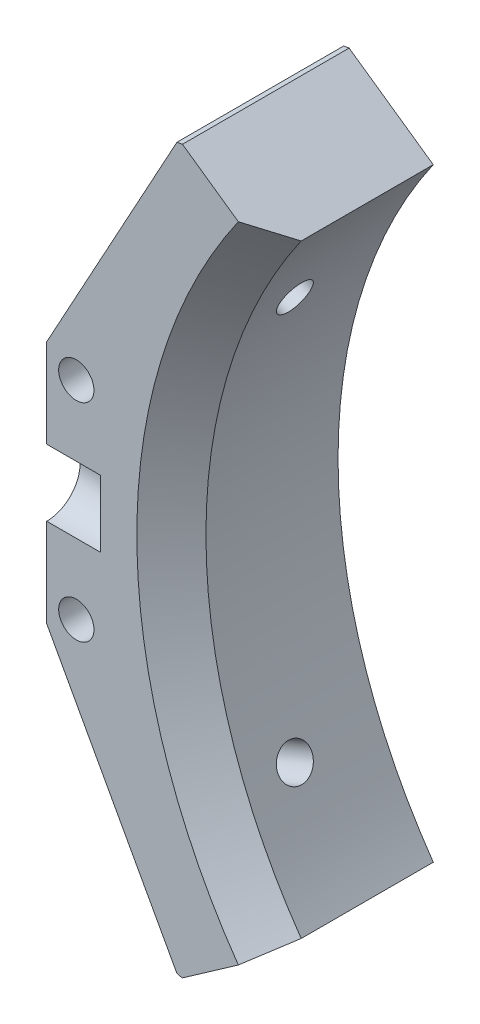
ISO-10303-21;
HEADER;
FILE_DESCRIPTION(('STEP AP214'),'2;1');
FILE_NAME('part.step','',(''),(''),'','','');
FILE_SCHEMA(('AUTOMOTIVE_DESIGN { 1 0 10303 214 1 1 1 1 }'));
ENDSEC;
DATA;
#1=APPLICATION_CONTEXT('core data for automotive mechanical design processes');
#2=APPLICATION_PROTOCOL_DEFINITION('international standard','automotive_design',2000,#1);
#3=PRODUCT_CONTEXT('',#1,'mechanical');
#4=PRODUCT('Part','Part','',(#3));
#5=PRODUCT_RELATED_PRODUCT_CATEGORY('part','',(#4));
#6=PRODUCT_DEFINITION_FORMATION('','',#4);
#7=PRODUCT_DEFINITION_CONTEXT('part definition',#1,'design');
#8=PRODUCT_DEFINITION('design','',#6,#7);
#9=PRODUCT_DEFINITION_SHAPE('','',#8);
#10=(LENGTH_UNIT() NAMED_UNIT(*) SI_UNIT(.MILLI.,.METRE.));
#11=(NAMED_UNIT(*) PLANE_ANGLE_UNIT() SI_UNIT($,.RADIAN.));
#12=(NAMED_UNIT(*) SI_UNIT($,.STERADIAN.) SOLID_ANGLE_UNIT());
#13=UNCERTAINTY_MEASURE_WITH_UNIT(LENGTH_MEASURE(1.E-05),#10,'distance_accuracy_value','');
#14=(GEOMETRIC_REPRESENTATION_CONTEXT(3) GLOBAL_UNCERTAINTY_ASSIGNED_CONTEXT((#13)) GLOBAL_UNIT_ASSIGNED_CONTEXT((#10,
#11,#12)) REPRESENTATION_CONTEXT('',''));
#15=CARTESIAN_POINT('',(0.,0.,0.));
#16=DIRECTION('',(0.,0.,1.));
#17=DIRECTION('',(1.,0.,0.));
#18=AXIS2_PLACEMENT_3D('',#15,#16,#17);
#19=CARTESIAN_POINT('',(-78.7145361699616,-32.6046284375058,12.0578499999987));
#20=DIRECTION('',(0.923879532511284,0.382683432365096,0.));
#21=DIRECTION('',(-0.382683432365096,0.923879532511284,0.));
#22=AXIS2_PLACEMENT_3D('',#19,#20,#21);
#23=PLANE('',#22);
#24=CARTESIAN_POINT('',(-78.7145361699615,-32.6046284375059,12.0578499999987));
#25=DIRECTION('',(0.923879532511284,0.382683432365096,0.));
#26=DIRECTION('',(-0.382683432365096,0.923879532511284,0.));
#27=AXIS2_PLACEMENT_3D('',#24,#25,#26);
#28=CIRCLE('',#27,5.);
#29=CARTESIAN_POINT('',(-80.627953331787,-27.9852307749494,12.0578499999987));
#30=VERTEX_POINT('',#29);
#31=EDGE_CURVE('E325',#30,#30,#28,.F.);
#32=ORIENTED_EDGE('',*,*,#31,.T.);
#33=EDGE_LOOP('',(#32));
#34=FACE_BOUND('',#33,.T.);
#35=CARTESIAN_POINT('',(-78.7145361699616,-32.6046284375059,12.0578499999987));
#36=DIRECTION('',(-0.923879532511285,-0.382683432365095,0.));
#37=DIRECTION('',(0.382683432365095,-0.923879532511285,0.));
#38=AXIS2_PLACEMENT_3D('',#35,#36,#37);
#39=CIRCLE('',#38,2.5);
#40=CARTESIAN_POINT('',(-77.7578275890489,-34.9143272687841,12.0578499999987));
#41=VERTEX_POINT('',#40);
#42=EDGE_CURVE('E343',#41,#41,#39,.F.);
#43=ORIENTED_EDGE('',*,*,#42,.T.);
#44=EDGE_LOOP('',(#43));
#45=FACE_BOUND('',#44,.T.);
#46=ADVANCED_FACE('F64',(#34,#45),#23,.F.);
#47=CARTESIAN_POINT('',(-78.7145361699616,32.6046284375058,12.0578499999987));
#48=DIRECTION('',(0.923879532511284,-0.382683432365096,0.));
#49=DIRECTION('',(0.382683432365096,0.923879532511284,0.));
#50=AXIS2_PLACEMENT_3D('',#47,#48,#49);
#51=PLANE('',#50);
#52=CARTESIAN_POINT('',(-78.7145361699615,32.6046284375059,12.0578499999987));
#53=DIRECTION('',(0.923879532511284,-0.382683432365096,0.));
#54=DIRECTION('',(0.382683432365096,0.923879532511284,0.));
#55=AXIS2_PLACEMENT_3D('',#52,#53,#54);
#56=CIRCLE('',#55,5.);
#57=CARTESIAN_POINT('',(-76.801119008136,37.2240261000623,12.0578499999987));
#58=VERTEX_POINT('',#57);
#59=EDGE_CURVE('E218',#58,#58,#56,.F.);
#60=ORIENTED_EDGE('',*,*,#59,.T.);
#61=EDGE_LOOP('',(#60));
#62=FACE_BOUND('',#61,.T.);
#63=CARTESIAN_POINT('',(-78.7145361699617,32.6046284375059,12.0578499999987));
#64=DIRECTION('',(-0.923879532511285,0.382683432365095,0.));
#65=DIRECTION('',(-0.382683432365095,-0.923879532511285,0.));
#66=AXIS2_PLACEMENT_3D('',#63,#64,#65);
#67=CIRCLE('',#66,2.5);
#68=CARTESIAN_POINT('',(-79.6712447508744,30.2949296062277,12.0578499999987));
#69=VERTEX_POINT('',#68);
#70=EDGE_CURVE('E346',#69,#69,#67,.F.);
#71=ORIENTED_EDGE('',*,*,#70,.T.);
#72=EDGE_LOOP('',(#71));
#73=FACE_BOUND('',#72,.T.);
#74=ADVANCED_FACE('F550',(#62,#73),#51,.F.);
#75=CARTESIAN_POINT('',(-86.49,0.,0.));
#76=DIRECTION('',(-1.,0.,0.));
#77=DIRECTION('',(0.,0.,1.));
#78=AXIS2_PLACEMENT_3D('',#75,#76,#77);
#79=PLANE('',#78);
#80=DIRECTION('',(0.,1.,0.));
#81=VECTOR('',#80,1.);
#82=CARTESIAN_POINT('',(-86.49,-21.209,24.1156999999974));
#83=LINE('',#82,#81);
#84=CARTESIAN_POINT('',(-86.49,4.82600000000003,24.1156999999974));
#85=VERTEX_POINT('',#84);
#86=CARTESIAN_POINT('',(-86.49,-4.82599999999994,24.1156999999974));
#87=VERTEX_POINT('',#86);
#88=EDGE_CURVE('E338',#85,#87,#83,.F.);
#89=ORIENTED_EDGE('',*,*,#88,.F.);
#90=CARTESIAN_POINT('',(-86.49,0.,24.1156999999974));
#91=DIRECTION('',(-1.,0.,0.));
#92=DIRECTION('',(0.,0.,1.));
#93=AXIS2_PLACEMENT_3D('',#90,#91,#92);
#94=CIRCLE('',#93,4.826);
#95=EDGE_CURVE('E351',#85,#87,#94,.T.);
#96=ORIENTED_EDGE('',*,*,#95,.T.);
#97=EDGE_LOOP('',(#89,#96));
#98=FACE_BOUND('',#97,.T.);
#99=ADVANCED_FACE('F525',(#98),#79,.T.);
#100=CARTESIAN_POINT('',(-1.27459187326294E-13,-3.07713698692186E-13,12.0578499999987));
#101=DIRECTION('',(0.923879532511284,-0.382683432365096,0.));
#102=DIRECTION('',(0.382683432365096,0.923879532511284,0.));
#103=AXIS2_PLACEMENT_3D('',#100,#101,#102);
#104=CYLINDRICAL_SURFACE('',#103,5.);
#105=ORIENTED_EDGE('',*,*,#59,.F.);
#106=EDGE_LOOP('',(#105));
#107=FACE_BOUND('',#106,.T.);
#108=CARTESIAN_POINT('',(-84.7046375756921,35.0858096797497,12.0578499999987));
#109=DIRECTION('',(0.877185534800813,-0.480151577667108,0.));
#110=DIRECTION('',(0.480151577667108,0.877185534800813,0.));
#111=AXIS2_PLACEMENT_3D('',#108,#109,#110);
#112=ELLIPSE('',#111,5.02937246252399,5.);
#113=CARTESIAN_POINT('',(-82.2897764531357,39.4975024530013,12.0578499999987));
#114=VERTEX_POINT('',#113);
#115=EDGE_CURVE('E283',#114,#114,#112,.F.);
#116=ORIENTED_EDGE('',*,*,#115,.T.);
#117=EDGE_LOOP('',(#116));
#118=FACE_BOUND('',#117,.T.);
#119=ADVANCED_FACE('F540',(#107,#118),#104,.F.);
#120=CARTESIAN_POINT('',(-86.49,0.,24.1156999999974));
#121=DIRECTION('',(-1.,0.,0.));
#122=DIRECTION('',(0.,0.,1.));
#123=AXIS2_PLACEMENT_3D('',#120,#121,#122);
#124=CYLINDRICAL_SURFACE('',#123,4.826);
#125=DIRECTION('',(1.,0.,0.));
#126=VECTOR('',#125,1.);
#127=CARTESIAN_POINT('',(-104.49,-4.82599999999994,24.1156999999974));
#128=LINE('',#127,#126);
#129=CARTESIAN_POINT('',(-94.239999992,-4.82599999999994,24.1156999999974));
#130=VERTEX_POINT('',#129);
#131=EDGE_CURVE('E370',#87,#130,#128,.F.);
#132=ORIENTED_EDGE('',*,*,#131,.F.);
#133=ORIENTED_EDGE('',*,*,#95,.F.);
#134=DIRECTION('',(1.,0.,0.));
#135=VECTOR('',#134,1.);
#136=CARTESIAN_POINT('',(-104.49,4.826,24.1156999999974));
#137=LINE('',#136,#135);
#138=CARTESIAN_POINT('',(-94.239999992,4.826,24.1156999999974));
#139=VERTEX_POINT('',#138);
#140=EDGE_CURVE('E334',#139,#85,#137,.T.);
#141=ORIENTED_EDGE('',*,*,#140,.F.);
#142=CARTESIAN_POINT('',(-94.239999992,0.,24.1156999999974));
#143=DIRECTION('',(1.,0.,0.));
#144=DIRECTION('',(0.,0.,-1.));
#145=AXIS2_PLACEMENT_3D('',#142,#143,#144);
#146=CIRCLE('',#145,4.826);
#147=EDGE_CURVE('E282',#139,#130,#146,.F.);
#148=ORIENTED_EDGE('',*,*,#147,.T.);
#149=EDGE_LOOP('',(#132,#133,#141,#148));
#150=FACE_BOUND('',#149,.T.);
#151=ADVANCED_FACE('F527',(#150),#124,.F.);
#152=CARTESIAN_POINT('',(-1.27459187326294E-13,3.07713698692186E-13,12.0578499999987));
#153=DIRECTION('',(0.923879532511284,0.382683432365096,0.));
#154=DIRECTION('',(-0.382683432365096,0.923879532511284,0.));
#155=AXIS2_PLACEMENT_3D('',#152,#153,#154);
#156=CYLINDRICAL_SURFACE('',#155,5.);
#157=ORIENTED_EDGE('',*,*,#31,.F.);
#158=EDGE_LOOP('',(#157));
#159=FACE_BOUND('',#158,.T.);
#160=CARTESIAN_POINT('',(-84.7046375756921,-35.0858096797497,12.0578499999987));
#161=DIRECTION('',(-0.877185534800813,-0.480151577667108,0.));
#162=DIRECTION('',(0.480151577667108,-0.877185534800813,0.));
#163=AXIS2_PLACEMENT_3D('',#160,#161,#162);
#164=ELLIPSE('',#163,5.02937246252399,5.);
#165=CARTESIAN_POINT('',(-82.2897764531357,-39.4975024530013,12.0578499999987));
#166=VERTEX_POINT('',#165);
#167=EDGE_CURVE('E357',#166,#166,#164,.F.);
#168=ORIENTED_EDGE('',*,*,#167,.F.);
#169=EDGE_LOOP('',(#168));
#170=FACE_BOUND('',#169,.T.);
#171=ADVANCED_FACE('F531',(#159,#170),#156,.F.);
#172=CARTESIAN_POINT('',(-78.7145361699616,-32.6046284375059,12.0578499999987));
#173=DIRECTION('',(-0.923879532511285,-0.382683432365095,0.));
#174=DIRECTION('',(0.382683432365095,-0.923879532511285,0.));
#175=AXIS2_PLACEMENT_3D('',#172,#173,#174);
#176=CYLINDRICAL_SURFACE('',#175,2.5);
#177=CARTESIAN_POINT('',(-69.4050128348201,-31.4544781135924,12.0578499999987));
#178=CARTESIAN_POINT('',(-69.4050155262785,-31.4544729264997,11.9175821214027));
#179=CARTESIAN_POINT('',(-69.4099109432,-31.4436772281154,11.7771248785826));
#180=CARTESIAN_POINT('',(-69.4293504182207,-31.4007298800319,11.4999926930088));
#181=CARTESIAN_POINT('',(-69.4439150884446,-31.3685326080248,11.363326481447));
#182=CARTESIAN_POINT('',(-69.4821899394872,-31.2836608235691,11.0979628689418));
#183=CARTESIAN_POINT('',(-69.5058923428029,-31.2310037250273,10.9692587989066));
#184=CARTESIAN_POINT('',(-69.561621038899,-31.1066792753156,10.7234353046449));
#185=CARTESIAN_POINT('',(-69.5936434227056,-31.035020851208,10.6063104757271));
#186=CARTESIAN_POINT('',(-69.6649599302289,-30.8746019239935,10.3868257325083));
#187=CARTESIAN_POINT('',(-69.7042579022574,-30.7858323691865,10.2844736832697));
#188=CARTESIAN_POINT('',(-69.7888219672717,-30.5936484736216,10.0975042049073));
#189=CARTESIAN_POINT('',(-69.8340885791487,-30.4902328595322,10.0128883193575));
#190=CARTESIAN_POINT('',(-69.9291380895632,-30.2716011412831,9.86378854849302));
#191=CARTESIAN_POINT('',(-69.9789218344216,-30.1563828252691,9.79930844587155));
#192=CARTESIAN_POINT('',(-70.0814368361719,-29.9173712531017,9.692335985796));
#193=CARTESIAN_POINT('',(-70.1341680545008,-29.7935781091312,9.64984334074576));
#194=CARTESIAN_POINT('',(-70.2409568782755,-29.5409337715377,9.5880657560836));
#195=CARTESIAN_POINT('',(-70.2950140001858,-29.4120844118462,9.56877248075875));
#196=CARTESIAN_POINT('',(-70.4028879484659,-29.152925510869,9.5539156287366));
#197=CARTESIAN_POINT('',(-70.4567047754644,-29.0226159734072,9.55835198991231));
#198=CARTESIAN_POINT('',(-70.5625599130229,-28.7642941941806,9.59082138801434));
#199=CARTESIAN_POINT('',(-70.6145989097948,-28.6362810753093,9.61884521101529));
#200=CARTESIAN_POINT('',(-70.7155154061952,-28.3861600109105,9.69768024276973));
#201=CARTESIAN_POINT('',(-70.7643928679184,-28.2640521361883,9.7484917246782));
#202=CARTESIAN_POINT('',(-70.8577332025921,-28.0292281668644,9.87147234767087));
#203=CARTESIAN_POINT('',(-70.9021950455273,-27.9165142645413,9.94364645638132));
#204=CARTESIAN_POINT('',(-70.985587935264,-27.7037791616017,10.1072932617145));
#205=CARTESIAN_POINT('',(-71.0245194383835,-27.6037569138475,10.1987643645591));
#206=CARTESIAN_POINT('',(-71.0959430328462,-27.4192759631007,10.3984420561186));
#207=CARTESIAN_POINT('',(-71.1284333307795,-27.3348215950951,10.506653290861));
#208=CARTESIAN_POINT('',(-71.1862328692133,-27.1839438385448,10.7367896512081));
#209=CARTESIAN_POINT('',(-71.2115387127945,-27.117528979995,10.8587212260806));
#210=CARTESIAN_POINT('',(-71.2544058608657,-27.0046904567927,11.1128705628823));
#211=CARTESIAN_POINT('',(-71.2719606080216,-26.9582837195476,11.2450969232729));
#212=CARTESIAN_POINT('',(-71.2988878374524,-26.8869869517858,11.5158211215115));
#213=CARTESIAN_POINT('',(-71.3082777283444,-26.8620511433562,11.6543049505942));
#214=CARTESIAN_POINT('',(-71.31514560753,-26.8438077554102,11.8377003491377));
#215=CARTESIAN_POINT('',(-71.3163765176452,-26.8405373657908,11.8816526201377));
#216=CARTESIAN_POINT('',(-71.3180189895794,-26.8361728379483,11.9696803564153));
#217=CARTESIAN_POINT('',(-71.3184305513848,-26.8350786997608,12.0137558216948));
#218=CARTESIAN_POINT('',(-71.3184282319656,-26.8350860220129,12.1981178785948));
#219=CARTESIAN_POINT('',(-71.3142561029324,-26.84618131605,12.3385751214149));
#220=CARTESIAN_POINT('',(-71.2976335264784,-26.8902954617237,12.6157073069886));
#221=CARTESIAN_POINT('',(-71.2851653941875,-26.9233611481767,12.7523735185504));
#222=CARTESIAN_POINT('',(-71.2522163865886,-27.0104389692178,13.0177371310556));
#223=CARTESIAN_POINT('',(-71.2317423252471,-27.0644332907893,13.1464412010908));
#224=CARTESIAN_POINT('',(-71.1832378027049,-27.191750091164,13.3922646953525));
#225=CARTESIAN_POINT('',(-71.1552108898286,-27.265063493519,13.5093895242704));
#226=CARTESIAN_POINT('',(-71.0922059646448,-27.4289251908633,13.7288742674891));
#227=CARTESIAN_POINT('',(-71.0572242729862,-27.5194826075385,13.8312263167277));
#228=CARTESIAN_POINT('',(-70.9811255610137,-27.7151729671436,14.0181957950901));
#229=CARTESIAN_POINT('',(-70.9400080072301,-27.8203071773663,14.1028116806399));
#230=CARTESIAN_POINT('',(-70.8526221900362,-28.0421133012853,14.2519114515044));
#231=CARTESIAN_POINT('',(-70.8063529610481,-28.1587873774379,14.3163915541259));
#232=CARTESIAN_POINT('',(-70.7098353104975,-28.4002831338105,14.4233640142014));
#233=CARTESIAN_POINT('',(-70.6595869409921,-28.5251047074371,14.4658566592517));
#234=CARTESIAN_POINT('',(-70.5564515180973,-28.7792623332238,14.5276342439138));
#235=CARTESIAN_POINT('',(-70.5035654195821,-28.9085967466874,14.5469275192387));
#236=CARTESIAN_POINT('',(-70.3965908036385,-29.1681281633154,14.5617843712608));
#237=CARTESIAN_POINT('',(-70.3425022893586,-29.2983251642206,14.5573480100851));
#238=CARTESIAN_POINT('',(-70.2346920931303,-29.555837131631,14.5248786119831));
#239=CARTESIAN_POINT('',(-70.1809702761991,-29.6831532035692,14.4968547889821));
#240=CARTESIAN_POINT('',(-70.0754667143834,-29.9313742432616,14.4180197572277));
#241=CARTESIAN_POINT('',(-70.0236849927628,-30.0522791341456,14.3672082753192));
#242=CARTESIAN_POINT('',(-69.9236409552747,-30.2843263388456,14.2442276523266));
#243=CARTESIAN_POINT('',(-69.8753794612516,-30.3954663741558,14.1720535436161));
#244=CARTESIAN_POINT('',(-69.7839207052022,-30.6048604858764,14.0084067382829));
#245=CARTESIAN_POINT('',(-69.7407230254032,-30.7031156253905,13.9169356354383));
#246=CARTESIAN_POINT('',(-69.6607794021117,-30.8840674646445,13.7172579438788));
#247=CARTESIAN_POINT('',(-69.6240352557855,-30.9667598309536,13.6090467091364));
#248=CARTESIAN_POINT('',(-69.5582190165746,-31.1143169613166,13.3789103487893));
#249=CARTESIAN_POINT('',(-69.5291505533223,-31.1791732917685,13.2569787739168));
#250=CARTESIAN_POINT('',(-69.4796733194782,-31.2892738277952,13.0028294371152));
#251=CARTESIAN_POINT('',(-69.4592718816354,-31.3345014271499,12.8706030767246));
#252=CARTESIAN_POINT('',(-69.4278978802035,-31.4039562816401,12.599878878486));
#253=CARTESIAN_POINT('',(-69.4169052564928,-31.4282282163993,12.4613950494033));
#254=CARTESIAN_POINT('',(-69.4088615571089,-31.4459845636723,12.2779996508597));
#255=CARTESIAN_POINT('',(-69.4074194273215,-31.4491674632388,12.2340473798597));
#256=CARTESIAN_POINT('',(-69.4054946431299,-31.4534150535154,12.1460196435822));
#257=CARTESIAN_POINT('',(-69.4050119887415,-31.4544797441909,12.1019441783026));
#258=CARTESIAN_POINT('',(-69.4050128348201,-31.4544781135924,12.0578499999987));
#259=B_SPLINE_CURVE_WITH_KNOTS('',3,(#177,#178,#179,#180,#181,#182,#183,#184,#185,#186,#187,
#188,#189,#190,#191,#192,#193,#194,#195,#196,#197,#198,#199,#200,#201,#202,#203,#204,#205,#206,
#207,#208,#209,#210,#211,#212,#213,#214,#215,#216,#217,#218,#219,#220,#221,#222,#223,#224,#225,
#226,#227,#228,#229,#230,#231,#232,#233,#234,#235,#236,#237,#238,#239,#240,#241,#242,#243,#244,
#245,#246,#247,#248,#249,#250,#251,#252,#253,#254,#255,#256,#257,#258),.UNSPECIFIED.,.T.,.F.,(4,
2,2,2,2,2,2,2,2,2,2,2,2,2,2,2,2,2,2,2,2,2,2,2,2,2,2,2,2,2,2,2,2,2,2,2,2,2,2,2,4),(0.,
0.420635912406375,0.842171393729873,1.26334887806186,1.68432883741539,2.10553210720218,
2.52677201899923,2.94809101707436,3.3694045041536,3.79056656476162,4.21172752271834,
4.63272403968186,5.05372560325303,5.47482514277553,5.89588991643313,6.3170717620388,
6.73845241844234,7.1601888779578,7.58102391574594,7.71325372348252,7.84548353338854,
8.26611944579492,8.68765492711841,9.1088324114504,9.52981237080393,9.95101564059073,
10.3722555523878,10.7935745504629,11.2148880375421,11.6360500981502,12.0572110561069,
12.4782075730704,12.8992091366416,13.3203086761641,13.7413734498217,14.1625552954273,
14.5839359518309,15.0056724113463,15.4265074491345,15.5587372568711,15.6909670667771),.UNSPECIFIED.);
#260=CARTESIAN_POINT('',(-69.4050128348201,-31.4544781135924,12.0578499999987));
#261=VERTEX_POINT('',#260);
#262=EDGE_CURVE('E255',#261,#261,#259,.T.);
#263=ORIENTED_EDGE('',*,*,#262,.T.);
#264=EDGE_LOOP('',(#263));
#265=FACE_BOUND('',#264,.T.);
#266=ORIENTED_EDGE('',*,*,#42,.F.);
#267=EDGE_LOOP('',(#266));
#268=FACE_BOUND('',#267,.T.);
#269=ADVANCED_FACE('F439',(#265,#268),#176,.F.);
#270=CARTESIAN_POINT('',(-78.7145361699616,32.6046284375059,12.0578499999987));
#271=DIRECTION('',(-0.923879532511285,0.382683432365095,0.));
#272=DIRECTION('',(-0.382683432365095,-0.923879532511285,0.));
#273=AXIS2_PLACEMENT_3D('',#270,#271,#272);
#274=CYLINDRICAL_SURFACE('',#273,2.5);
#275=ORIENTED_EDGE('',*,*,#70,.F.);
#276=EDGE_LOOP('',(#275));
#277=FACE_BOUND('',#276,.T.);
#278=CARTESIAN_POINT('',(-71.3184299966455,26.835080451036,12.0578499999987));
#279=CARTESIAN_POINT('',(-71.3184282319656,26.8350860220129,11.9175821214027));
#280=CARTESIAN_POINT('',(-71.3142561029324,26.84618131605,11.7771248785826));
#281=CARTESIAN_POINT('',(-71.2976335264784,26.8902954617237,11.4999926930088));
#282=CARTESIAN_POINT('',(-71.2851653941875,26.9233611481767,11.363326481447));
#283=CARTESIAN_POINT('',(-71.2522163865886,27.0104389692179,11.0979628689418));
#284=CARTESIAN_POINT('',(-71.2317423252471,27.0644332907893,10.9692587989066));
#285=CARTESIAN_POINT('',(-71.1832378027049,27.191750091164,10.7234353046449));
#286=CARTESIAN_POINT('',(-71.1552108898286,27.265063493519,10.6063104757271));
#287=CARTESIAN_POINT('',(-71.0922059646448,27.4289251908633,10.3868257325083));
#288=CARTESIAN_POINT('',(-71.0572242729862,27.5194826075385,10.2844736832697));
#289=CARTESIAN_POINT('',(-70.9811255610137,27.7151729671436,10.0975042049073));
#290=CARTESIAN_POINT('',(-70.9400080072301,27.8203071773663,10.0128883193575));
#291=CARTESIAN_POINT('',(-70.8526221900362,28.0421133012853,9.86378854849302));
#292=CARTESIAN_POINT('',(-70.8063529610481,28.1587873774379,9.79930844587155));
#293=CARTESIAN_POINT('',(-70.7098353104975,28.4002831338106,9.692335985796));
#294=CARTESIAN_POINT('',(-70.6595869409921,28.5251047074371,9.64984334074576));
#295=CARTESIAN_POINT('',(-70.5564515180973,28.7792623332238,9.5880657560836));
#296=CARTESIAN_POINT('',(-70.5035654195821,28.9085967466874,9.56877248075875));
#297=CARTESIAN_POINT('',(-70.3965908036385,29.1681281633155,9.5539156287366));
#298=CARTESIAN_POINT('',(-70.3425022893586,29.2983251642206,9.55835198991231));
#299=CARTESIAN_POINT('',(-70.2346920931303,29.555837131631,9.59082138801434));
#300=CARTESIAN_POINT('',(-70.1809702761991,29.6831532035692,9.61884521101529));
#301=CARTESIAN_POINT('',(-70.0754667143834,29.9313742432616,9.69768024276973));
#302=CARTESIAN_POINT('',(-70.0236849927628,30.0522791341456,9.7484917246782));
#303=CARTESIAN_POINT('',(-69.9236409552747,30.2843263388456,9.87147234767087));
#304=CARTESIAN_POINT('',(-69.8753794612516,30.3954663741558,9.94364645638132));
#305=CARTESIAN_POINT('',(-69.7839207052022,30.6048604858764,10.1072932617145));
#306=CARTESIAN_POINT('',(-69.7407230254032,30.7031156253905,10.1987643645591));
#307=CARTESIAN_POINT('',(-69.6607794021117,30.8840674646445,10.3984420561186));
#308=CARTESIAN_POINT('',(-69.6240352557855,30.9667598309536,10.506653290861));
#309=CARTESIAN_POINT('',(-69.5582190165746,31.1143169613166,10.7367896512081));
#310=CARTESIAN_POINT('',(-69.5291505533223,31.1791732917685,10.8587212260806));
#311=CARTESIAN_POINT('',(-69.4796733194782,31.2892738277952,11.1128705628823));
#312=CARTESIAN_POINT('',(-69.4592718816354,31.3345014271499,11.2450969232729));
#313=CARTESIAN_POINT('',(-69.4278978802035,31.4039562816401,11.5158211215114));
#314=CARTESIAN_POINT('',(-69.4169052564928,31.4282282163994,11.6543049505942));
#315=CARTESIAN_POINT('',(-69.4088615571089,31.4459845636723,11.8377003491377));
#316=CARTESIAN_POINT('',(-69.4074194273214,31.4491674632387,11.8816526201377));
#317=CARTESIAN_POINT('',(-69.4054946431299,31.4534150535154,11.9696803564153));
#318=CARTESIAN_POINT('',(-69.4050119887415,31.4544797441909,12.0137558216948));
#319=CARTESIAN_POINT('',(-69.4050155262785,31.4544729264997,12.1981178785948));
#320=CARTESIAN_POINT('',(-69.4099109432,31.4436772281154,12.3385751214149));
#321=CARTESIAN_POINT('',(-69.4293504182207,31.4007298800319,12.6157073069886));
#322=CARTESIAN_POINT('',(-69.4439150884446,31.3685326080248,12.7523735185504));
#323=CARTESIAN_POINT('',(-69.4821899394872,31.2836608235691,13.0177371310556));
#324=CARTESIAN_POINT('',(-69.5058923428029,31.2310037250273,13.1464412010908));
#325=CARTESIAN_POINT('',(-69.561621038899,31.1066792753156,13.3922646953525));
#326=CARTESIAN_POINT('',(-69.5936434227056,31.035020851208,13.5093895242704));
#327=CARTESIAN_POINT('',(-69.6649599302289,30.8746019239935,13.7288742674891));
#328=CARTESIAN_POINT('',(-69.7042579022574,30.7858323691865,13.8312263167277));
#329=CARTESIAN_POINT('',(-69.7888219672717,30.5936484736216,14.0181957950901));
#330=CARTESIAN_POINT('',(-69.8340885791487,30.4902328595322,14.1028116806399));
#331=CARTESIAN_POINT('',(-69.9291380895632,30.2716011412831,14.2519114515044));
#332=CARTESIAN_POINT('',(-69.9789218344216,30.1563828252691,14.3163915541259));
#333=CARTESIAN_POINT('',(-70.0814368361719,29.9173712531017,14.4233640142014));
#334=CARTESIAN_POINT('',(-70.1341680545008,29.7935781091312,14.4658566592517));
#335=CARTESIAN_POINT('',(-70.2409568782755,29.5409337715377,14.5276342439138));
#336=CARTESIAN_POINT('',(-70.2950140001858,29.4120844118462,14.5469275192387));
#337=CARTESIAN_POINT('',(-70.4028879484659,29.152925510869,14.5617843712608));
#338=CARTESIAN_POINT('',(-70.4567047754644,29.0226159734072,14.5573480100851));
#339=CARTESIAN_POINT('',(-70.5625599130229,28.7642941941806,14.5248786119831));
#340=CARTESIAN_POINT('',(-70.6145989097948,28.6362810753093,14.4968547889821));
#341=CARTESIAN_POINT('',(-70.7155154061952,28.3861600109105,14.4180197572277));
#342=CARTESIAN_POINT('',(-70.7643928679184,28.2640521361883,14.3672082753192));
#343=CARTESIAN_POINT('',(-70.8577332025921,28.0292281668644,14.2442276523266));
#344=CARTESIAN_POINT('',(-70.9021950455273,27.9165142645413,14.1720535436161));
#345=CARTESIAN_POINT('',(-70.985587935264,27.7037791616017,14.0084067382829));
#346=CARTESIAN_POINT('',(-71.0245194383835,27.6037569138475,13.9169356354383));
#347=CARTESIAN_POINT('',(-71.0959430328462,27.4192759631007,13.7172579438788));
#348=CARTESIAN_POINT('',(-71.1284333307795,27.3348215950951,13.6090467091364));
#349=CARTESIAN_POINT('',(-71.1862328692133,27.1839438385448,13.3789103487893));
#350=CARTESIAN_POINT('',(-71.2115387127945,27.117528979995,13.2569787739168));
#351=CARTESIAN_POINT('',(-71.2544058608657,27.0046904567927,13.0028294371152));
#352=CARTESIAN_POINT('',(-71.2719606080216,26.9582837195476,12.8706030767246));
#353=CARTESIAN_POINT('',(-71.2988878374524,26.8869869517858,12.599878878486));
#354=CARTESIAN_POINT('',(-71.3082777283444,26.8620511433562,12.4613950494033));
#355=CARTESIAN_POINT('',(-71.31514560753,26.8438077554102,12.2779996508597));
#356=CARTESIAN_POINT('',(-71.3163765176452,26.8405373657908,12.2340473798597));
#357=CARTESIAN_POINT('',(-71.3180189895794,26.8361728379483,12.1460196435822));
#358=CARTESIAN_POINT('',(-71.3184305513848,26.8350786997608,12.1019441783026));
#359=CARTESIAN_POINT('',(-71.3184299966455,26.835080451036,12.0578499999987));
#360=B_SPLINE_CURVE_WITH_KNOTS('',3,(#278,#279,#280,#281,#282,#283,#284,#285,#286,#287,#288,
#289,#290,#291,#292,#293,#294,#295,#296,#297,#298,#299,#300,#301,#302,#303,#304,#305,#306,#307,
#308,#309,#310,#311,#312,#313,#314,#315,#316,#317,#318,#319,#320,#321,#322,#323,#324,#325,#326,
#327,#328,#329,#330,#331,#332,#333,#334,#335,#336,#337,#338,#339,#340,#341,#342,#343,#344,#345,
#346,#347,#348,#349,#350,#351,#352,#353,#354,#355,#356,#357,#358,#359),.UNSPECIFIED.,.T.,.F.,(4,
2,2,2,2,2,2,2,2,2,2,2,2,2,2,2,2,2,2,2,2,2,2,2,2,2,2,2,2,2,2,2,2,2,2,2,2,2,2,2,4),(0.,
0.420635912406375,0.842171393729873,1.26334887806186,1.68432883741539,2.10553210720219,
2.52677201899924,2.94809101707436,3.3694045041536,3.79056656476163,4.21172752271834,
4.63272403968185,5.05372560325302,5.47482514277551,5.89588991643312,6.31707176203879,
6.73845241844234,7.16018887795779,7.58102391574594,7.71325372348252,7.84548353338854,
8.26611944579491,8.68765492711842,9.1088324114504,9.52981237080393,9.95101564059073,
10.3722555523878,10.7935745504629,11.2148880375422,11.6360500981502,12.0572110561069,
12.4782075730704,12.8992091366416,13.3203086761641,13.7413734498217,14.1625552954273,
14.5839359518309,15.0056724113463,15.4265074491345,15.5587372568711,15.6909670667771),.UNSPECIFIED.);
#361=CARTESIAN_POINT('',(-71.3184299966455,26.835080451036,12.0578499999987));
#362=VERTEX_POINT('',#361);
#363=EDGE_CURVE('E254',#362,#362,#360,.T.);
#364=ORIENTED_EDGE('',*,*,#363,.T.);
#365=EDGE_LOOP('',(#364));
#366=FACE_BOUND('',#365,.T.);
#367=ADVANCED_FACE('F407',(#277,#366),#274,.F.);
#368=CARTESIAN_POINT('',(0.,0.,24.1156999999974));
#369=DIRECTION('',(0.,0.,1.));
#370=DIRECTION('',(0.,-1.,0.));
#371=AXIS2_PLACEMENT_3D('',#368,#369,#370);
#372=CONICAL_SURFACE('',#371,81.2,0.785398163397447);
#373=CARTESIAN_POINT('',(0.,0.,19.1156999999974));
#374=DIRECTION('',(0.,0.,-1.));
#375=DIRECTION('',(-1.,0.,0.));
#376=AXIS2_PLACEMENT_3D('',#373,#374,#375);
#377=CIRCLE('',#376,76.2);
#378=CARTESIAN_POINT('',(-62.4193857748214,-43.7065244499493,19.1156999999974));
#379=VERTEX_POINT('',#378);
#380=CARTESIAN_POINT('',(-62.4193857748214,43.7065244499493,19.1156999999974));
#381=VERTEX_POINT('',#380);
#382=EDGE_CURVE('E275',#379,#381,#377,.T.);
#383=ORIENTED_EDGE('',*,*,#382,.T.);
#384=DIRECTION('',(-0.579227965339575,0.405579787672637,0.707106781186544));
#385=VECTOR('',#384,1.);
#386=CARTESIAN_POINT('',(-62.4193857748214,43.7065244499494,19.1156999999974));
#387=LINE('',#386,#385);
#388=CARTESIAN_POINT('',(-66.5151459962664,46.5744066317046,24.1156999999974));
#389=VERTEX_POINT('',#388);
#390=EDGE_CURVE('E263',#381,#389,#387,.T.);
#391=ORIENTED_EDGE('',*,*,#390,.T.);
#392=CARTESIAN_POINT('',(0.,0.,24.1156999999974));
#393=DIRECTION('',(0.,0.,1.));
#394=DIRECTION('',(0.,-1.,0.));
#395=AXIS2_PLACEMENT_3D('',#392,#393,#394);
#396=CIRCLE('',#395,81.2);
#397=CARTESIAN_POINT('',(-66.5151459962664,-46.5744066317046,24.1156999999975));
#398=VERTEX_POINT('',#397);
#399=EDGE_CURVE('E339',#398,#389,#396,.F.);
#400=ORIENTED_EDGE('',*,*,#399,.F.);
#401=DIRECTION('',(-0.579227965339575,-0.405579787672637,0.707106781186544));
#402=VECTOR('',#401,1.);
#403=CARTESIAN_POINT('',(-62.4193857748214,-43.7065244499494,19.1156999999974));
#404=LINE('',#403,#402);
#405=EDGE_CURVE('E386',#379,#398,#404,.T.);
#406=ORIENTED_EDGE('',*,*,#405,.F.);
#407=EDGE_LOOP('',(#383,#391,#400,#406));
#408=FACE_BOUND('',#407,.T.);
#409=ADVANCED_FACE('F432',(#408),#372,.F.);
#410=CARTESIAN_POINT('',(-104.49,-21.209,24.1156999999974));
#411=DIRECTION('',(0.,0.,1.));
#412=DIRECTION('',(1.,0.,0.));
#413=AXIS2_PLACEMENT_3D('',#410,#411,#412);
#414=PLANE('',#413);
#415=CARTESIAN_POINT('',(-89.96,15.,24.1156999999974));
#416=DIRECTION('',(0.,0.,1.));
#417=DIRECTION('',(1.,0.,0.));
#418=AXIS2_PLACEMENT_3D('',#415,#416,#417);
#419=CIRCLE('',#418,2.55269999999999);
#420=CARTESIAN_POINT('',(-87.4073,15.,24.1156999999974));
#421=VERTEX_POINT('',#420);
#422=EDGE_CURVE('E188',#421,#421,#419,.T.);
#423=ORIENTED_EDGE('',*,*,#422,.F.);
#424=EDGE_LOOP('',(#423));
#425=FACE_BOUND('',#424,.T.);
#426=CARTESIAN_POINT('',(-89.96,-15.,24.1156999999974));
#427=DIRECTION('',(0.,0.,1.));
#428=DIRECTION('',(1.,0.,0.));
#429=AXIS2_PLACEMENT_3D('',#426,#427,#428);
#430=CIRCLE('',#429,2.55269999999999);
#431=CARTESIAN_POINT('',(-87.4073,-15.,24.1156999999974));
#432=VERTEX_POINT('',#431);
#433=EDGE_CURVE('E187',#432,#432,#430,.T.);
#434=ORIENTED_EDGE('',*,*,#433,.F.);
#435=EDGE_LOOP('',(#434));
#436=FACE_BOUND('',#435,.T.);
#437=DIRECTION('',(0.480151577667108,-0.877185534800813,0.));
#438=VECTOR('',#437,1.);
#439=CARTESIAN_POINT('',(-79.953873513561,-43.7649470779863,24.1156999999974));
#440=LINE('',#439,#438);
#441=CARTESIAN_POINT('',(-75.4234425214473,-52.0415595427498,24.1156999999974));
#442=VERTEX_POINT('',#441);
#443=CARTESIAN_POINT('',(-94.239999992,-17.6657232534844,24.1156999999974));
#444=VERTEX_POINT('',#443);
#445=EDGE_CURVE('E362',#442,#444,#440,.F.);
#446=ORIENTED_EDGE('',*,*,#445,.F.);
#447=DIRECTION('',(-0.959782276582228,0.280745403450591,0.));
#448=VECTOR('',#447,1.);
#449=CARTESIAN_POINT('',(-110.507003366657,-41.7792858122471,24.1156999999974));
#450=LINE('',#449,#448);
#451=CARTESIAN_POINT('',(-74.6472863123707,-52.2685925828199,24.1156999999974));
#452=VERTEX_POINT('',#451);
#453=EDGE_CURVE('E288',#442,#452,#450,.F.);
#454=ORIENTED_EDGE('',*,*,#453,.T.);
#455=DIRECTION('',(0.819152044288995,0.573576436351042,0.));
#456=VECTOR('',#455,1.);
#457=CARTESIAN_POINT('',(0.,0.,24.1156999999974));
#458=LINE('',#457,#456);
#459=EDGE_CURVE('E382',#398,#452,#458,.F.);
#460=ORIENTED_EDGE('',*,*,#459,.F.);
#461=ORIENTED_EDGE('',*,*,#399,.T.);
#462=DIRECTION('',(0.819152044288995,-0.573576436351042,0.));
#463=VECTOR('',#462,1.);
#464=CARTESIAN_POINT('',(0.,0.,24.1156999999974));
#465=LINE('',#464,#463);
#466=CARTESIAN_POINT('',(-74.5983847215052,52.2343513202654,24.1156999999974));
#467=VERTEX_POINT('',#466);
#468=EDGE_CURVE('E245',#389,#467,#465,.F.);
#469=ORIENTED_EDGE('',*,*,#468,.T.);
#470=DIRECTION('',(0.984807753012205,0.173648177666948,0.));
#471=VECTOR('',#470,1.);
#472=CARTESIAN_POINT('',(-116.148210283477,44.9079960299587,24.1156999999974));
#473=LINE('',#472,#471);
#474=CARTESIAN_POINT('',(-75.3947785192413,52.0939256064556,24.1156999999974));
#475=VERTEX_POINT('',#474);
#476=EDGE_CURVE('E84',#467,#475,#473,.F.);
#477=ORIENTED_EDGE('',*,*,#476,.T.);
#478=DIRECTION('',(0.480151577667108,0.877185534800813,0.));
#479=VECTOR('',#478,1.);
#480=CARTESIAN_POINT('',(-79.953873513561,43.7649470779863,24.1156999999974));
#481=LINE('',#480,#479);
#482=CARTESIAN_POINT('',(-94.239999992,17.6657232534844,24.1156999999974));
#483=VERTEX_POINT('',#482);
#484=EDGE_CURVE('E278',#475,#483,#481,.F.);
#485=ORIENTED_EDGE('',*,*,#484,.T.);
#486=DIRECTION('',(0.,-1.,0.));
#487=VECTOR('',#486,1.);
#488=CARTESIAN_POINT('',(-94.239999992,0.,24.1156999999974));
#489=LINE('',#488,#487);
#490=EDGE_CURVE('E353',#483,#139,#489,.T.);
#491=ORIENTED_EDGE('',*,*,#490,.T.);
#492=ORIENTED_EDGE('',*,*,#140,.T.);
#493=ORIENTED_EDGE('',*,*,#88,.T.);
#494=ORIENTED_EDGE('',*,*,#131,.T.);
#495=DIRECTION('',(0.,-1.,0.));
#496=VECTOR('',#495,1.);
#497=CARTESIAN_POINT('',(-94.239999992,0.,24.1156999999974));
#498=LINE('',#497,#496);
#499=EDGE_CURVE('E366',#130,#444,#498,.T.);
#500=ORIENTED_EDGE('',*,*,#499,.T.);
#501=EDGE_LOOP('',(#446,#454,#460,#461,#469,#477,#485,#491,#492,#493,#494,#500));
#502=FACE_BOUND('',#501,.T.);
#503=ADVANCED_FACE('F430',(#425,#436,#502),#414,.T.);
#504=CARTESIAN_POINT('',(-79.953873513561,43.7649470779863,-47.75925175729));
#505=DIRECTION('',(0.877185534800813,-0.480151577667108,0.));
#506=DIRECTION('',(0.480151577667108,0.877185534800813,0.));
#507=AXIS2_PLACEMENT_3D('',#504,#505,#506);
#508=PLANE('',#507);
#509=ORIENTED_EDGE('',*,*,#484,.F.);
#510=DIRECTION('',(0.,0.,-1.));
#511=VECTOR('',#510,1.);
#512=CARTESIAN_POINT('',(-75.3947785192413,52.0939256064556,-47.75925175729));
#513=LINE('',#512,#511);
#514=CARTESIAN_POINT('',(-75.3947785192414,52.0939256064556,0.));
#515=VERTEX_POINT('',#514);
#516=EDGE_CURVE('E74',#475,#515,#513,.T.);
#517=ORIENTED_EDGE('',*,*,#516,.T.);
#518=DIRECTION('',(-0.480151577667105,-0.877185534800814,0.));
#519=VECTOR('',#518,1.);
#520=CARTESIAN_POINT('',(-75.1185462696287,52.5985723573483,0.));
#521=LINE('',#520,#519);
#522=CARTESIAN_POINT('',(-94.239999992,17.6657232534842,0.));
#523=VERTEX_POINT('',#522);
#524=EDGE_CURVE('E241',#515,#523,#521,.T.);
#525=ORIENTED_EDGE('',*,*,#524,.T.);
#526=DIRECTION('',(0.,0.,1.));
#527=VECTOR('',#526,1.);
#528=CARTESIAN_POINT('',(-94.239999992,17.6657232534844,-47.75925175729));
#529=LINE('',#528,#527);
#530=EDGE_CURVE('E314',#523,#483,#529,.T.);
#531=ORIENTED_EDGE('',*,*,#530,.T.);
#532=EDGE_LOOP('',(#509,#517,#525,#531));
#533=FACE_BOUND('',#532,.T.);
#534=ORIENTED_EDGE('',*,*,#115,.F.);
#535=EDGE_LOOP('',(#534));
#536=FACE_BOUND('',#535,.T.);
#537=ADVANCED_FACE('F295',(#533,#536),#508,.F.);
#538=CARTESIAN_POINT('',(-94.239999992,0.,70.5254753793369));
#539=DIRECTION('',(1.,0.,0.));
#540=DIRECTION('',(0.,0.,-1.));
#541=AXIS2_PLACEMENT_3D('',#538,#539,#540);
#542=PLANE('',#541);
#543=ORIENTED_EDGE('',*,*,#530,.F.);
#544=DIRECTION('',(0.,-1.,0.));
#545=VECTOR('',#544,1.);
#546=CARTESIAN_POINT('',(-94.239999992,0.,0.));
#547=LINE('',#546,#545);
#548=CARTESIAN_POINT('',(-94.239999992,-17.6657232534842,0.));
#549=VERTEX_POINT('',#548);
#550=EDGE_CURVE('E236',#523,#549,#547,.T.);
#551=ORIENTED_EDGE('',*,*,#550,.T.);
#552=DIRECTION('',(0.,0.,-1.));
#553=VECTOR('',#552,1.);
#554=CARTESIAN_POINT('',(-94.239999992,-17.6657232534844,70.5254753793369));
#555=LINE('',#554,#553);
#556=EDGE_CURVE('E376',#444,#549,#555,.T.);
#557=ORIENTED_EDGE('',*,*,#556,.F.);
#558=ORIENTED_EDGE('',*,*,#499,.F.);
#559=ORIENTED_EDGE('',*,*,#147,.F.);
#560=ORIENTED_EDGE('',*,*,#490,.F.);
#561=EDGE_LOOP('',(#543,#551,#557,#558,#559,#560));
#562=FACE_BOUND('',#561,.T.);
#563=ADVANCED_FACE('F426',(#562),#542,.F.);
#564=CARTESIAN_POINT('',(-79.953873513561,-43.7649470779863,-47.75925175729));
#565=DIRECTION('',(-0.877185534800813,-0.480151577667108,0.));
#566=DIRECTION('',(0.480151577667108,-0.877185534800813,0.));
#567=AXIS2_PLACEMENT_3D('',#564,#565,#566);
#568=PLANE('',#567);
#569=DIRECTION('',(0.480151577667105,-0.877185534800814,0.));
#570=VECTOR('',#569,1.);
#571=CARTESIAN_POINT('',(-94.49,-17.209,0.));
#572=LINE('',#571,#570);
#573=CARTESIAN_POINT('',(-75.4234425214473,-52.0415595427498,0.));
#574=VERTEX_POINT('',#573);
#575=EDGE_CURVE('E235',#549,#574,#572,.T.);
#576=ORIENTED_EDGE('',*,*,#575,.T.);
#577=DIRECTION('',(0.,0.,1.));
#578=VECTOR('',#577,1.);
#579=CARTESIAN_POINT('',(-75.4234425214473,-52.0415595427498,-47.75925175729));
#580=LINE('',#579,#578);
#581=EDGE_CURVE('E284',#574,#442,#580,.T.);
#582=ORIENTED_EDGE('',*,*,#581,.T.);
#583=ORIENTED_EDGE('',*,*,#445,.T.);
#584=ORIENTED_EDGE('',*,*,#556,.T.);
#585=EDGE_LOOP('',(#576,#582,#583,#584));
#586=FACE_BOUND('',#585,.T.);
#587=ORIENTED_EDGE('',*,*,#167,.T.);
#588=EDGE_LOOP('',(#587));
#589=FACE_BOUND('',#588,.T.);
#590=ADVANCED_FACE('F422',(#586,#589),#568,.T.);
#591=CARTESIAN_POINT('',(0.,0.,-47.75925175729));
#592=DIRECTION('',(0.573576436351042,-0.819152044288995,0.));
#593=DIRECTION('',(0.819152044288995,0.573576436351042,0.));
#594=AXIS2_PLACEMENT_3D('',#591,#592,#593);
#595=PLANE('',#594);
#596=ORIENTED_EDGE('',*,*,#459,.T.);
#597=DIRECTION('',(0.,0.,-1.));
#598=VECTOR('',#597,1.);
#599=CARTESIAN_POINT('',(-74.6472863123708,-52.2685925828199,-47.75925175729));
#600=LINE('',#599,#598);
#601=CARTESIAN_POINT('',(-74.6472863123708,-52.2685925828199,0.));
#602=VERTEX_POINT('',#601);
#603=EDGE_CURVE('E222',#452,#602,#600,.T.);
#604=ORIENTED_EDGE('',*,*,#603,.T.);
#605=DIRECTION('',(0.819152044288994,0.573576436351043,0.));
#606=VECTOR('',#605,1.);
#607=CARTESIAN_POINT('',(-75.1185462696287,-52.5985723573483,0.));
#608=LINE('',#607,#606);
#609=CARTESIAN_POINT('',(-62.4193857748214,-43.7065244499494,0.));
#610=VERTEX_POINT('',#609);
#611=EDGE_CURVE('E231',#602,#610,#608,.T.);
#612=ORIENTED_EDGE('',*,*,#611,.T.);
#613=DIRECTION('',(0.,0.,-1.));
#614=VECTOR('',#613,1.);
#615=CARTESIAN_POINT('',(-62.4193857748214,-43.7065244499494,70.5254753793369));
#616=LINE('',#615,#614);
#617=EDGE_CURVE('E250',#610,#379,#616,.F.);
#618=ORIENTED_EDGE('',*,*,#617,.T.);
#619=ORIENTED_EDGE('',*,*,#405,.T.);
#620=EDGE_LOOP('',(#596,#604,#612,#618,#619));
#621=FACE_BOUND('',#620,.T.);
#622=ADVANCED_FACE('F416',(#621),#595,.T.);
#623=CARTESIAN_POINT('',(0.,0.,70.5254753793369));
#624=DIRECTION('',(0.,0.,-1.));
#625=DIRECTION('',(-1.,0.,0.));
#626=AXIS2_PLACEMENT_3D('',#623,#624,#625);
#627=CYLINDRICAL_SURFACE('',#626,76.2);
#628=ORIENTED_EDGE('',*,*,#382,.F.);
#629=ORIENTED_EDGE('',*,*,#617,.F.);
#630=CARTESIAN_POINT('',(0.,0.,0.));
#631=DIRECTION('',(0.,0.,-1.));
#632=DIRECTION('',(-1.,0.,0.));
#633=AXIS2_PLACEMENT_3D('',#630,#631,#632);
#634=CIRCLE('',#633,76.2);
#635=CARTESIAN_POINT('',(-62.4193857748214,43.7065244499494,0.));
#636=VERTEX_POINT('',#635);
#637=EDGE_CURVE('E223',#610,#636,#634,.T.);
#638=ORIENTED_EDGE('',*,*,#637,.T.);
#639=DIRECTION('',(0.,0.,1.));
#640=VECTOR('',#639,1.);
#641=CARTESIAN_POINT('',(-62.4193857748214,43.7065244499494,-47.75925175729));
#642=LINE('',#641,#640);
#643=EDGE_CURVE('E228',#636,#381,#642,.T.);
#644=ORIENTED_EDGE('',*,*,#643,.T.);
#645=EDGE_LOOP('',(#628,#629,#638,#644));
#646=FACE_BOUND('',#645,.T.);
#647=ORIENTED_EDGE('',*,*,#363,.F.);
#648=EDGE_LOOP('',(#647));
#649=FACE_BOUND('',#648,.T.);
#650=ORIENTED_EDGE('',*,*,#262,.F.);
#651=EDGE_LOOP('',(#650));
#652=FACE_BOUND('',#651,.T.);
#653=ADVANCED_FACE('F410',(#646,#649,#652),#627,.F.);
#654=CARTESIAN_POINT('',(0.,0.,-47.75925175729));
#655=DIRECTION('',(-0.573576436351042,-0.819152044288995,0.));
#656=DIRECTION('',(0.819152044288995,-0.573576436351042,0.));
#657=AXIS2_PLACEMENT_3D('',#654,#655,#656);
#658=PLANE('',#657);
#659=DIRECTION('',(-0.819152044288994,0.573576436351043,0.));
#660=VECTOR('',#659,1.);
#661=CARTESIAN_POINT('',(-62.4193857748214,43.7065244499493,0.));
#662=LINE('',#661,#660);
#663=CARTESIAN_POINT('',(-74.5983847215052,52.2343513202654,0.));
#664=VERTEX_POINT('',#663);
#665=EDGE_CURVE('E219',#636,#664,#662,.T.);
#666=ORIENTED_EDGE('',*,*,#665,.T.);
#667=DIRECTION('',(0.,0.,1.));
#668=VECTOR('',#667,1.);
#669=CARTESIAN_POINT('',(-74.5983847215052,52.2343513202654,-47.75925175729));
#670=LINE('',#669,#668);
#671=EDGE_CURVE('E12',#664,#467,#670,.T.);
#672=ORIENTED_EDGE('',*,*,#671,.T.);
#673=ORIENTED_EDGE('',*,*,#468,.F.);
#674=ORIENTED_EDGE('',*,*,#390,.F.);
#675=ORIENTED_EDGE('',*,*,#643,.F.);
#676=EDGE_LOOP('',(#666,#672,#673,#674,#675));
#677=FACE_BOUND('',#676,.T.);
#678=ADVANCED_FACE('F415',(#677),#658,.F.);
#679=CARTESIAN_POINT('',(0.,0.,0.));
#680=DIRECTION('',(0.,0.,1.));
#681=DIRECTION('',(1.,0.,0.));
#682=AXIS2_PLACEMENT_3D('',#679,#680,#681);
#683=PLANE('',#682);
#684=CARTESIAN_POINT('',(-85.4210723416652,12.7,0.));
#685=DIRECTION('',(0.,0.,-1.));
#686=DIRECTION('',(-1.,0.,0.));
#687=AXIS2_PLACEMENT_3D('',#684,#685,#686);
#688=CIRCLE('',#687,1.72719999999998);
#689=CARTESIAN_POINT('',(-87.1482723416652,12.7,0.));
#690=VERTEX_POINT('',#689);
#691=EDGE_CURVE('E202',#690,#690,#688,.T.);
#692=ORIENTED_EDGE('',*,*,#691,.F.);
#693=EDGE_LOOP('',(#692));
#694=FACE_BOUND('',#693,.T.);
#695=CARTESIAN_POINT('',(-85.4210723416652,-12.7,0.));
#696=DIRECTION('',(0.,0.,-1.));
#697=DIRECTION('',(-1.,0.,0.));
#698=AXIS2_PLACEMENT_3D('',#695,#696,#697);
#699=CIRCLE('',#698,1.72719999999998);
#700=CARTESIAN_POINT('',(-87.1482723416652,-12.7,0.));
#701=VERTEX_POINT('',#700);
#702=EDGE_CURVE('E210',#701,#701,#699,.T.);
#703=ORIENTED_EDGE('',*,*,#702,.F.);
#704=EDGE_LOOP('',(#703));
#705=FACE_BOUND('',#704,.T.);
#706=ORIENTED_EDGE('',*,*,#611,.F.);
#707=DIRECTION('',(0.959782276582228,-0.280745403450591,0.));
#708=VECTOR('',#707,1.);
#709=CARTESIAN_POINT('',(-74.6472863123708,-52.2685925828199,0.));
#710=LINE('',#709,#708);
#711=EDGE_CURVE('E373',#602,#574,#710,.F.);
#712=ORIENTED_EDGE('',*,*,#711,.T.);
#713=ORIENTED_EDGE('',*,*,#575,.F.);
#714=ORIENTED_EDGE('',*,*,#550,.F.);
#715=ORIENTED_EDGE('',*,*,#524,.F.);
#716=DIRECTION('',(-0.984807753012205,-0.173648177666948,0.));
#717=VECTOR('',#716,1.);
#718=CARTESIAN_POINT('',(-75.3947785192413,52.0939256064556,0.));
#719=LINE('',#718,#717);
#720=EDGE_CURVE('E240',#515,#664,#719,.F.);
#721=ORIENTED_EDGE('',*,*,#720,.T.);
#722=ORIENTED_EDGE('',*,*,#665,.F.);
#723=ORIENTED_EDGE('',*,*,#637,.F.);
#724=EDGE_LOOP('',(#706,#712,#713,#714,#715,#721,#722,#723));
#725=FACE_BOUND('',#724,.T.);
#726=ADVANCED_FACE('F303',(#694,#705,#725),#683,.F.);
#727=CARTESIAN_POINT('',(-85.4210723416652,-12.7,10.668));
#728=DIRECTION('',(0.,0.,-1.));
#729=DIRECTION('',(-1.,0.,0.));
#730=AXIS2_PLACEMENT_3D('',#727,#728,#729);
#731=CONICAL_SURFACE('',#730,1.72719999999998,1.02974425867665);
#732=CARTESIAN_POINT('',(-85.4210723416652,-12.7,11.7058064611844));
#733=VERTEX_POINT('',#732);
#734=VERTEX_LOOP('',#733);
#735=FACE_BOUND('',#734,.T.);
#736=CARTESIAN_POINT('',(-85.4210723416652,-12.7,10.668));
#737=DIRECTION('',(0.,0.,-1.));
#738=DIRECTION('',(-1.,0.,0.));
#739=AXIS2_PLACEMENT_3D('',#736,#737,#738);
#740=CIRCLE('',#739,1.72719999999998);
#741=CARTESIAN_POINT('',(-87.1482723416652,-12.7,10.668));
#742=VERTEX_POINT('',#741);
#743=EDGE_CURVE('E214',#742,#742,#740,.T.);
#744=ORIENTED_EDGE('',*,*,#743,.T.);
#745=EDGE_LOOP('',(#744));
#746=FACE_BOUND('',#745,.T.);
#747=ADVANCED_FACE('F442',(#735,#746),#731,.F.);
#748=CARTESIAN_POINT('',(-85.4210723416652,-12.7,0.));
#749=DIRECTION('',(0.,0.,-1.));
#750=DIRECTION('',(-1.,0.,0.));
#751=AXIS2_PLACEMENT_3D('',#748,#749,#750);
#752=CYLINDRICAL_SURFACE('',#751,1.72719999999998);
#753=ORIENTED_EDGE('',*,*,#743,.F.);
#754=EDGE_LOOP('',(#753));
#755=FACE_BOUND('',#754,.T.);
#756=ORIENTED_EDGE('',*,*,#702,.T.);
#757=EDGE_LOOP('',(#756));
#758=FACE_BOUND('',#757,.T.);
#759=ADVANCED_FACE('F449',(#755,#758),#752,.F.);
#760=CARTESIAN_POINT('',(-85.4210723416652,12.7,10.668));
#761=DIRECTION('',(0.,0.,-1.));
#762=DIRECTION('',(-1.,0.,0.));
#763=AXIS2_PLACEMENT_3D('',#760,#761,#762);
#764=CONICAL_SURFACE('',#763,1.72719999999998,1.02974425867665);
#765=CARTESIAN_POINT('',(-85.4210723416652,12.7,11.7058064611844));
#766=VERTEX_POINT('',#765);
#767=VERTEX_LOOP('',#766);
#768=FACE_BOUND('',#767,.T.);
#769=CARTESIAN_POINT('',(-85.4210723416652,12.7,10.668));
#770=DIRECTION('',(0.,0.,-1.));
#771=DIRECTION('',(-1.,0.,0.));
#772=AXIS2_PLACEMENT_3D('',#769,#770,#771);
#773=CIRCLE('',#772,1.72719999999998);
#774=CARTESIAN_POINT('',(-87.1482723416652,12.7,10.668));
#775=VERTEX_POINT('',#774);
#776=EDGE_CURVE('E207',#775,#775,#773,.T.);
#777=ORIENTED_EDGE('',*,*,#776,.T.);
#778=EDGE_LOOP('',(#777));
#779=FACE_BOUND('',#778,.T.);
#780=ADVANCED_FACE('F457',(#768,#779),#764,.F.);
#781=CARTESIAN_POINT('',(-85.4210723416652,12.7,0.));
#782=DIRECTION('',(0.,0.,-1.));
#783=DIRECTION('',(-1.,0.,0.));
#784=AXIS2_PLACEMENT_3D('',#781,#782,#783);
#785=CYLINDRICAL_SURFACE('',#784,1.72719999999998);
#786=ORIENTED_EDGE('',*,*,#776,.F.);
#787=EDGE_LOOP('',(#786));
#788=FACE_BOUND('',#787,.T.);
#789=ORIENTED_EDGE('',*,*,#691,.T.);
#790=EDGE_LOOP('',(#789));
#791=FACE_BOUND('',#790,.T.);
#792=ADVANCED_FACE('F461',(#788,#791),#785,.F.);
#793=CARTESIAN_POINT('',(-74.6472863123708,-52.2685925828199,-47.75925175729));
#794=DIRECTION('',(0.280745403450591,0.959782276582228,0.));
#795=DIRECTION('',(0.,0.,-1.));
#796=AXIS2_PLACEMENT_3D('',#793,#794,#795);
#797=PLANE('',#796);
#798=ORIENTED_EDGE('',*,*,#453,.F.);
#799=ORIENTED_EDGE('',*,*,#581,.F.);
#800=ORIENTED_EDGE('',*,*,#711,.F.);
#801=ORIENTED_EDGE('',*,*,#603,.F.);
#802=EDGE_LOOP('',(#798,#799,#800,#801));
#803=FACE_BOUND('',#802,.T.);
#804=ADVANCED_FACE('F465',(#803),#797,.F.);
#805=CARTESIAN_POINT('',(-75.3947785192413,52.0939256064556,-47.75925175729));
#806=DIRECTION('',(0.173648177666948,-0.984807753012205,0.));
#807=DIRECTION('',(0.,0.,-1.));
#808=AXIS2_PLACEMENT_3D('',#805,#806,#807);
#809=PLANE('',#808);
#810=ORIENTED_EDGE('',*,*,#476,.F.);
#811=ORIENTED_EDGE('',*,*,#671,.F.);
#812=ORIENTED_EDGE('',*,*,#720,.F.);
#813=ORIENTED_EDGE('',*,*,#516,.F.);
#814=EDGE_LOOP('',(#810,#811,#812,#813));
#815=FACE_BOUND('',#814,.T.);
#816=ADVANCED_FACE('F67',(#815),#809,.F.);
#817=CARTESIAN_POINT('',(-89.96,-15.,24.1156999999974));
#818=DIRECTION('',(0.,0.,1.));
#819=DIRECTION('',(1.,0.,0.));
#820=AXIS2_PLACEMENT_3D('',#817,#818,#819);
#821=CYLINDRICAL_SURFACE('',#820,2.5527);
#822=CARTESIAN_POINT('',(-89.96,-15.,14.1156999999974));
#823=DIRECTION('',(0.,0.,1.));
#824=DIRECTION('',(1.,0.,0.));
#825=AXIS2_PLACEMENT_3D('',#822,#823,#824);
#826=CIRCLE('',#825,2.5527);
#827=CARTESIAN_POINT('',(-87.4073,-15.,14.1156999999974));
#828=VERTEX_POINT('',#827);
#829=EDGE_CURVE('E194',#828,#828,#826,.F.);
#830=ORIENTED_EDGE('',*,*,#829,.T.);
#831=EDGE_LOOP('',(#830));
#832=FACE_BOUND('',#831,.T.);
#833=ORIENTED_EDGE('',*,*,#433,.T.);
#834=EDGE_LOOP('',(#833));
#835=FACE_BOUND('',#834,.T.);
#836=ADVANCED_FACE('F467',(#832,#835),#821,.F.);
#837=CARTESIAN_POINT('',(-89.96,-15.,14.1156999999974));
#838=DIRECTION('',(0.,0.,1.));
#839=DIRECTION('',(1.,0.,0.));
#840=AXIS2_PLACEMENT_3D('',#837,#838,#839);
#841=PLANE('',#840);
#842=ORIENTED_EDGE('',*,*,#829,.F.);
#843=EDGE_LOOP('',(#842));
#844=FACE_BOUND('',#843,.T.);
#845=ADVANCED_FACE('F180',(#844),#841,.T.);
#846=CARTESIAN_POINT('',(-89.96,15.,14.1156999999974));
#847=DIRECTION('',(0.,0.,1.));
#848=DIRECTION('',(1.,0.,0.));
#849=AXIS2_PLACEMENT_3D('',#846,#847,#848);
#850=CONICAL_SURFACE('',#849,2.55270000000001,1.02974425867666);
#851=CARTESIAN_POINT('',(-89.96,15.,12.5818830978058));
#852=VERTEX_POINT('',#851);
#853=VERTEX_LOOP('',#852);
#854=FACE_BOUND('',#853,.T.);
#855=CARTESIAN_POINT('',(-89.96,15.,14.1156999999974));
#856=DIRECTION('',(0.,0.,1.));
#857=DIRECTION('',(1.,0.,0.));
#858=AXIS2_PLACEMENT_3D('',#855,#856,#857);
#859=CIRCLE('',#858,2.55270000000001);
#860=CARTESIAN_POINT('',(-87.4073,15.,14.1156999999974));
#861=VERTEX_POINT('',#860);
#862=EDGE_CURVE('E184',#861,#861,#859,.T.);
#863=ORIENTED_EDGE('',*,*,#862,.T.);
#864=EDGE_LOOP('',(#863));
#865=FACE_BOUND('',#864,.T.);
#866=ADVANCED_FACE('F176',(#854,#865),#850,.F.);
#867=CARTESIAN_POINT('',(-89.96,15.,24.1156999999974));
#868=DIRECTION('',(0.,0.,1.));
#869=DIRECTION('',(1.,0.,0.));
#870=AXIS2_PLACEMENT_3D('',#867,#868,#869);
#871=CYLINDRICAL_SURFACE('',#870,2.5527);
#872=ORIENTED_EDGE('',*,*,#862,.F.);
#873=EDGE_LOOP('',(#872));
#874=FACE_BOUND('',#873,.T.);
#875=ORIENTED_EDGE('',*,*,#422,.T.);
#876=EDGE_LOOP('',(#875));
#877=FACE_BOUND('',#876,.T.);
#878=ADVANCED_FACE('F179',(#874,#877),#871,.F.);
#879=CLOSED_SHELL('',(#46,#74,#99,#119,#151,#171,#269,#367,#409,#503,#537,#563,#590,#622,#653,
#678,#726,#747,#759,#780,#792,#804,#816,#836,#845,#866,#878));
#880=MANIFOLD_SOLID_BREP('B2',#879);
#881=ADVANCED_BREP_SHAPE_REPRESENTATION('',(#18,#880),#14);
#882=SHAPE_DEFINITION_REPRESENTATION(#9,#881);
ENDSEC;
END-ISO-10303-21;
